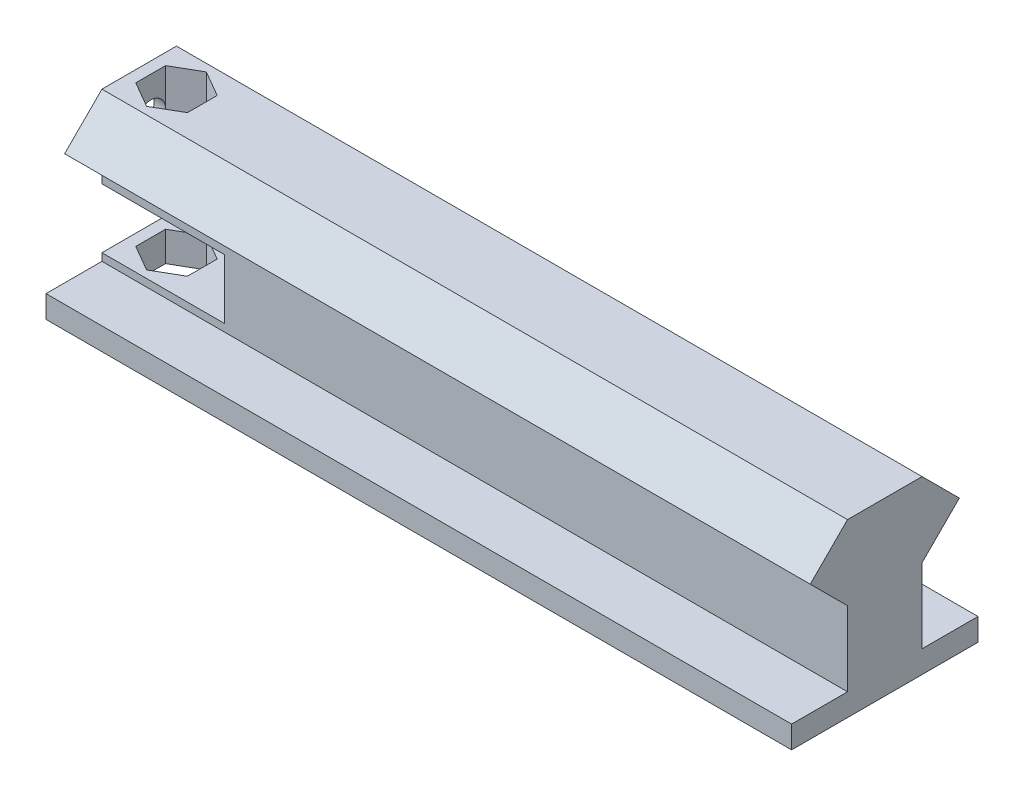
ISO-10303-21;
HEADER;
FILE_DESCRIPTION(('STEP AP214'),'2;1');
FILE_NAME('part.step','',(''),(''),'','','');
FILE_SCHEMA(('AUTOMOTIVE_DESIGN { 1 0 10303 214 1 1 1 1 }'));
ENDSEC;
DATA;
#1=APPLICATION_CONTEXT('core data for automotive mechanical design processes');
#2=APPLICATION_PROTOCOL_DEFINITION('international standard','automotive_design',2000,#1);
#3=PRODUCT_CONTEXT('',#1,'mechanical');
#4=PRODUCT('Part','Part','',(#3));
#5=PRODUCT_RELATED_PRODUCT_CATEGORY('part','',(#4));
#6=PRODUCT_DEFINITION_FORMATION('','',#4);
#7=PRODUCT_DEFINITION_CONTEXT('part definition',#1,'design');
#8=PRODUCT_DEFINITION('design','',#6,#7);
#9=PRODUCT_DEFINITION_SHAPE('','',#8);
#10=(LENGTH_UNIT() NAMED_UNIT(*) SI_UNIT(.MILLI.,.METRE.));
#11=(NAMED_UNIT(*) PLANE_ANGLE_UNIT() SI_UNIT($,.RADIAN.));
#12=(NAMED_UNIT(*) SI_UNIT($,.STERADIAN.) SOLID_ANGLE_UNIT());
#13=UNCERTAINTY_MEASURE_WITH_UNIT(LENGTH_MEASURE(1.E-05),#10,'distance_accuracy_value','');
#14=(GEOMETRIC_REPRESENTATION_CONTEXT(3) GLOBAL_UNCERTAINTY_ASSIGNED_CONTEXT((#13)) GLOBAL_UNIT_ASSIGNED_CONTEXT((#10,
#11,#12)) REPRESENTATION_CONTEXT('',''));
#15=CARTESIAN_POINT('',(0.,0.,0.));
#16=DIRECTION('',(0.,0.,1.));
#17=DIRECTION('',(1.,0.,0.));
#18=AXIS2_PLACEMENT_3D('',#15,#16,#17);
#19=CARTESIAN_POINT('',(-48.4641016151377,-8.,-2.));
#20=DIRECTION('',(-1.,0.,0.));
#21=DIRECTION('',(0.,0.,1.));
#22=AXIS2_PLACEMENT_3D('',#19,#20,#21);
#23=PLANE('',#22);
#24=DIRECTION('',(0.,1.,0.));
#25=VECTOR('',#24,1.);
#26=CARTESIAN_POINT('',(-48.4641016151377,-8.,2.));
#27=LINE('',#26,#25);
#28=CARTESIAN_POINT('',(-48.4641016151377,10.,2.));
#29=VERTEX_POINT('',#28);
#30=CARTESIAN_POINT('',(-48.4641016151377,15.,2.));
#31=VERTEX_POINT('',#30);
#32=EDGE_CURVE('E243',#29,#31,#27,.T.);
#33=ORIENTED_EDGE('',*,*,#32,.F.);
#34=CARTESIAN_POINT('',(-48.4641016151377,10.,0.));
#35=DIRECTION('',(-1.,0.,0.));
#36=DIRECTION('',(0.,0.,1.));
#37=AXIS2_PLACEMENT_3D('',#34,#35,#36);
#38=CIRCLE('',#37,2.);
#39=CARTESIAN_POINT('',(-48.4641016151377,10.,-2.));
#40=VERTEX_POINT('',#39);
#41=EDGE_CURVE('E54',#29,#40,#38,.T.);
#42=ORIENTED_EDGE('',*,*,#41,.T.);
#43=DIRECTION('',(0.,1.,0.));
#44=VECTOR('',#43,1.);
#45=CARTESIAN_POINT('',(-48.4641016151377,-8.,-2.));
#46=LINE('',#45,#44);
#47=CARTESIAN_POINT('',(-48.4641016151377,15.,-2.));
#48=VERTEX_POINT('',#47);
#49=EDGE_CURVE('E241',#40,#48,#46,.T.);
#50=ORIENTED_EDGE('',*,*,#49,.T.);
#51=DIRECTION('',(0.,0.,1.));
#52=VECTOR('',#51,1.);
#53=CARTESIAN_POINT('',(-48.4641016151377,15.,-2.));
#54=LINE('',#53,#52);
#55=EDGE_CURVE('E519',#48,#31,#54,.T.);
#56=ORIENTED_EDGE('',*,*,#55,.T.);
#57=EDGE_LOOP('',(#33,#42,#50,#56));
#58=FACE_BOUND('',#57,.T.);
#59=ADVANCED_FACE('F39',(#58),#23,.F.);
#60=CARTESIAN_POINT('',(50.,5.,-5.));
#61=DIRECTION('',(0.,0.,1.));
#62=DIRECTION('',(1.,0.,0.));
#63=AXIS2_PLACEMENT_3D('',#60,#61,#62);
#64=PLANE('',#63);
#65=DIRECTION('',(-1.,0.,0.));
#66=VECTOR('',#65,1.);
#67=CARTESIAN_POINT('',(50.,-4.,-5.));
#68=LINE('',#67,#66);
#69=CARTESIAN_POINT('',(-33.5435607626104,-4.,-5.));
#70=VERTEX_POINT('',#69);
#71=CARTESIAN_POINT('',(-50.,-4.,-5.));
#72=VERTEX_POINT('',#71);
#73=EDGE_CURVE('E323',#70,#72,#68,.T.);
#74=ORIENTED_EDGE('',*,*,#73,.F.);
#75=DIRECTION('',(0.,1.,0.));
#76=VECTOR('',#75,1.);
#77=CARTESIAN_POINT('',(-33.5435607626104,-4.,-5.));
#78=LINE('',#77,#76);
#79=CARTESIAN_POINT('',(-33.5435607626104,4.,-5.));
#80=VERTEX_POINT('',#79);
#81=EDGE_CURVE('E326',#70,#80,#78,.T.);
#82=ORIENTED_EDGE('',*,*,#81,.T.);
#83=DIRECTION('',(-1.,0.,0.));
#84=VECTOR('',#83,1.);
#85=CARTESIAN_POINT('',(50.,4.,-5.));
#86=LINE('',#85,#84);
#87=CARTESIAN_POINT('',(-50.,4.,-5.));
#88=VERTEX_POINT('',#87);
#89=EDGE_CURVE('E316',#80,#88,#86,.T.);
#90=ORIENTED_EDGE('',*,*,#89,.T.);
#91=DIRECTION('',(0.,1.,0.));
#92=VECTOR('',#91,1.);
#93=CARTESIAN_POINT('',(-50.,5.,-5.));
#94=LINE('',#93,#92);
#95=CARTESIAN_POINT('',(-50.,5.,-5.));
#96=VERTEX_POINT('',#95);
#97=EDGE_CURVE('E373',#88,#96,#94,.T.);
#98=ORIENTED_EDGE('',*,*,#97,.T.);
#99=DIRECTION('',(-1.,0.,0.));
#100=VECTOR('',#99,1.);
#101=CARTESIAN_POINT('',(50.,5.,-5.));
#102=LINE('',#101,#100);
#103=CARTESIAN_POINT('',(50.,5.,-5.));
#104=VERTEX_POINT('',#103);
#105=EDGE_CURVE('E448',#104,#96,#102,.T.);
#106=ORIENTED_EDGE('',*,*,#105,.F.);
#107=DIRECTION('',(0.,1.,0.));
#108=VECTOR('',#107,1.);
#109=CARTESIAN_POINT('',(50.,5.,-5.));
#110=LINE('',#109,#108);
#111=CARTESIAN_POINT('',(50.,-5.,-5.));
#112=VERTEX_POINT('',#111);
#113=EDGE_CURVE('E335',#112,#104,#110,.T.);
#114=ORIENTED_EDGE('',*,*,#113,.F.);
#115=DIRECTION('',(-1.,0.,0.));
#116=VECTOR('',#115,1.);
#117=CARTESIAN_POINT('',(50.,-5.,-5.));
#118=LINE('',#117,#116);
#119=CARTESIAN_POINT('',(-50.,-5.,-5.));
#120=VERTEX_POINT('',#119);
#121=EDGE_CURVE('E452',#112,#120,#118,.T.);
#122=ORIENTED_EDGE('',*,*,#121,.T.);
#123=EDGE_CURVE('E374',#120,#72,#94,.T.);
#124=ORIENTED_EDGE('',*,*,#123,.T.);
#125=EDGE_LOOP('',(#74,#82,#90,#98,#106,#114,#122,#124));
#126=FACE_BOUND('',#125,.T.);
#127=ADVANCED_FACE('F585',(#126),#64,.F.);
#128=CARTESIAN_POINT('',(50.,5.,5.));
#129=DIRECTION('',(0.,0.,-1.));
#130=DIRECTION('',(0.,1.,0.));
#131=AXIS2_PLACEMENT_3D('',#128,#129,#130);
#132=PLANE('',#131);
#133=DIRECTION('',(1.,0.,0.));
#134=VECTOR('',#133,1.);
#135=CARTESIAN_POINT('',(50.,-4.,5.));
#136=LINE('',#135,#134);
#137=CARTESIAN_POINT('',(-50.,-4.,5.));
#138=VERTEX_POINT('',#137);
#139=CARTESIAN_POINT('',(-33.5435607626104,-4.,5.));
#140=VERTEX_POINT('',#139);
#141=EDGE_CURVE('E320',#138,#140,#136,.T.);
#142=ORIENTED_EDGE('',*,*,#141,.F.);
#143=DIRECTION('',(0.,-1.,0.));
#144=VECTOR('',#143,1.);
#145=CARTESIAN_POINT('',(-50.,5.,5.));
#146=LINE('',#145,#144);
#147=CARTESIAN_POINT('',(-50.,-5.,5.));
#148=VERTEX_POINT('',#147);
#149=EDGE_CURVE('E393',#138,#148,#146,.T.);
#150=ORIENTED_EDGE('',*,*,#149,.T.);
#151=DIRECTION('',(-1.,0.,0.));
#152=VECTOR('',#151,1.);
#153=CARTESIAN_POINT('',(50.,-5.,5.));
#154=LINE('',#153,#152);
#155=CARTESIAN_POINT('',(50.,-5.,5.));
#156=VERTEX_POINT('',#155);
#157=EDGE_CURVE('E424',#156,#148,#154,.T.);
#158=ORIENTED_EDGE('',*,*,#157,.F.);
#159=DIRECTION('',(0.,-1.,0.));
#160=VECTOR('',#159,1.);
#161=CARTESIAN_POINT('',(50.,5.,5.));
#162=LINE('',#161,#160);
#163=CARTESIAN_POINT('',(50.,5.,5.));
#164=VERTEX_POINT('',#163);
#165=EDGE_CURVE('E354',#164,#156,#162,.T.);
#166=ORIENTED_EDGE('',*,*,#165,.F.);
#167=DIRECTION('',(-1.,0.,0.));
#168=VECTOR('',#167,1.);
#169=CARTESIAN_POINT('',(50.,5.,5.));
#170=LINE('',#169,#168);
#171=CARTESIAN_POINT('',(-50.,5.,5.));
#172=VERTEX_POINT('',#171);
#173=EDGE_CURVE('E428',#164,#172,#170,.T.);
#174=ORIENTED_EDGE('',*,*,#173,.T.);
#175=CARTESIAN_POINT('',(-50.,4.,5.));
#176=VERTEX_POINT('',#175);
#177=EDGE_CURVE('E394',#172,#176,#146,.T.);
#178=ORIENTED_EDGE('',*,*,#177,.T.);
#179=DIRECTION('',(1.,0.,0.));
#180=VECTOR('',#179,1.);
#181=CARTESIAN_POINT('',(50.,4.,5.));
#182=LINE('',#181,#180);
#183=CARTESIAN_POINT('',(-33.5435607626104,4.,5.));
#184=VERTEX_POINT('',#183);
#185=EDGE_CURVE('E309',#176,#184,#182,.T.);
#186=ORIENTED_EDGE('',*,*,#185,.T.);
#187=DIRECTION('',(0.,1.,0.));
#188=VECTOR('',#187,1.);
#189=CARTESIAN_POINT('',(-33.5435607626104,-4.,5.));
#190=LINE('',#189,#188);
#191=EDGE_CURVE('E463',#184,#140,#190,.F.);
#192=ORIENTED_EDGE('',*,*,#191,.T.);
#193=EDGE_LOOP('',(#142,#150,#158,#166,#174,#178,#186,#192));
#194=FACE_BOUND('',#193,.T.);
#195=ADVANCED_FACE('F556',(#194),#132,.F.);
#196=CARTESIAN_POINT('',(-50.,0.,0.));
#197=DIRECTION('',(-1.,0.,0.));
#198=DIRECTION('',(0.,0.,1.));
#199=AXIS2_PLACEMENT_3D('',#196,#197,#198);
#200=PLANE('',#199);
#201=ORIENTED_EDGE('',*,*,#149,.F.);
#202=DIRECTION('',(0.,0.,-1.));
#203=VECTOR('',#202,1.);
#204=CARTESIAN_POINT('',(-50.,-4.,0.));
#205=LINE('',#204,#203);
#206=EDGE_CURVE('E459',#138,#72,#205,.T.);
#207=ORIENTED_EDGE('',*,*,#206,.T.);
#208=ORIENTED_EDGE('',*,*,#123,.F.);
#209=DIRECTION('',(0.,0.,1.));
#210=VECTOR('',#209,1.);
#211=CARTESIAN_POINT('',(-50.,-5.,-5.));
#212=LINE('',#211,#210);
#213=CARTESIAN_POINT('',(-50.,-5.,-12.5));
#214=VERTEX_POINT('',#213);
#215=EDGE_CURVE('E330',#214,#120,#212,.T.);
#216=ORIENTED_EDGE('',*,*,#215,.F.);
#217=DIRECTION('',(0.,1.,0.));
#218=VECTOR('',#217,1.);
#219=CARTESIAN_POINT('',(-50.,-5.,-12.5));
#220=LINE('',#219,#218);
#221=CARTESIAN_POINT('',(-50.,-8.,-12.5));
#222=VERTEX_POINT('',#221);
#223=EDGE_CURVE('E336',#222,#214,#220,.T.);
#224=ORIENTED_EDGE('',*,*,#223,.F.);
#225=DIRECTION('',(0.,0.,-1.));
#226=VECTOR('',#225,1.);
#227=CARTESIAN_POINT('',(-50.,-8.,12.5));
#228=LINE('',#227,#226);
#229=CARTESIAN_POINT('',(-50.,-8.,12.5));
#230=VERTEX_POINT('',#229);
#231=EDGE_CURVE('E404',#230,#222,#228,.T.);
#232=ORIENTED_EDGE('',*,*,#231,.F.);
#233=DIRECTION('',(0.,-1.,0.));
#234=VECTOR('',#233,1.);
#235=CARTESIAN_POINT('',(-50.,-5.,12.5));
#236=LINE('',#235,#234);
#237=CARTESIAN_POINT('',(-50.,-5.,12.5));
#238=VERTEX_POINT('',#237);
#239=EDGE_CURVE('E401',#238,#230,#236,.T.);
#240=ORIENTED_EDGE('',*,*,#239,.F.);
#241=DIRECTION('',(0.,0.,1.));
#242=VECTOR('',#241,1.);
#243=CARTESIAN_POINT('',(-50.,-5.,5.));
#244=LINE('',#243,#242);
#245=EDGE_CURVE('E398',#148,#238,#244,.T.);
#246=ORIENTED_EDGE('',*,*,#245,.F.);
#247=EDGE_LOOP('',(#201,#207,#208,#216,#224,#232,#240,#246));
#248=FACE_BOUND('',#247,.T.);
#249=ADVANCED_FACE('F548',(#248),#200,.T.);
#250=CARTESIAN_POINT('',(50.,-5.,-5.));
#251=DIRECTION('',(0.,-1.,0.));
#252=DIRECTION('',(0.,0.,-1.));
#253=AXIS2_PLACEMENT_3D('',#250,#251,#252);
#254=PLANE('',#253);
#255=ORIENTED_EDGE('',*,*,#215,.T.);
#256=ORIENTED_EDGE('',*,*,#121,.F.);
#257=DIRECTION('',(0.,0.,1.));
#258=VECTOR('',#257,1.);
#259=CARTESIAN_POINT('',(50.,-5.,-5.));
#260=LINE('',#259,#258);
#261=CARTESIAN_POINT('',(50.,-5.,-12.5));
#262=VERTEX_POINT('',#261);
#263=EDGE_CURVE('E331',#262,#112,#260,.T.);
#264=ORIENTED_EDGE('',*,*,#263,.F.);
#265=DIRECTION('',(-1.,0.,0.));
#266=VECTOR('',#265,1.);
#267=CARTESIAN_POINT('',(50.,-5.,-12.5));
#268=LINE('',#267,#266);
#269=EDGE_CURVE('E369',#262,#214,#268,.T.);
#270=ORIENTED_EDGE('',*,*,#269,.T.);
#271=EDGE_LOOP('',(#255,#256,#264,#270));
#272=FACE_BOUND('',#271,.T.);
#273=ADVANCED_FACE('F41',(#272),#254,.F.);
#274=CARTESIAN_POINT('',(50.,5.,-5.));
#275=DIRECTION('',(0.,0.707106781186548,0.707106781186548));
#276=DIRECTION('',(0.,-0.707106781186548,0.707106781186548));
#277=AXIS2_PLACEMENT_3D('',#274,#275,#276);
#278=PLANE('',#277);
#279=DIRECTION('',(0.,0.707106781186548,-0.707106781186548));
#280=VECTOR('',#279,1.);
#281=CARTESIAN_POINT('',(-50.,5.,-5.));
#282=LINE('',#281,#280);
#283=CARTESIAN_POINT('',(-50.,10.,-10.));
#284=VERTEX_POINT('',#283);
#285=EDGE_CURVE('E378',#96,#284,#282,.T.);
#286=ORIENTED_EDGE('',*,*,#285,.T.);
#287=DIRECTION('',(-1.,0.,0.));
#288=VECTOR('',#287,1.);
#289=CARTESIAN_POINT('',(50.,10.,-10.));
#290=LINE('',#289,#288);
#291=CARTESIAN_POINT('',(50.,10.,-10.));
#292=VERTEX_POINT('',#291);
#293=EDGE_CURVE('E444',#292,#284,#290,.T.);
#294=ORIENTED_EDGE('',*,*,#293,.F.);
#295=DIRECTION('',(0.,0.707106781186548,-0.707106781186548));
#296=VECTOR('',#295,1.);
#297=CARTESIAN_POINT('',(50.,5.,-5.));
#298=LINE('',#297,#296);
#299=EDGE_CURVE('E339',#104,#292,#298,.T.);
#300=ORIENTED_EDGE('',*,*,#299,.F.);
#301=ORIENTED_EDGE('',*,*,#105,.T.);
#302=EDGE_LOOP('',(#286,#294,#300,#301));
#303=FACE_BOUND('',#302,.T.);
#304=ADVANCED_FACE('F580',(#303),#278,.F.);
#305=CARTESIAN_POINT('',(50.,10.,-10.));
#306=DIRECTION('',(0.,-0.707106781186548,0.707106781186547));
#307=DIRECTION('',(0.,-0.707106781186547,-0.707106781186548));
#308=AXIS2_PLACEMENT_3D('',#305,#306,#307);
#309=PLANE('',#308);
#310=DIRECTION('',(0.,0.707106781186547,0.707106781186548));
#311=VECTOR('',#310,1.);
#312=CARTESIAN_POINT('',(-50.,10.,-10.));
#313=LINE('',#312,#311);
#314=CARTESIAN_POINT('',(-50.,15.,-5.));
#315=VERTEX_POINT('',#314);
#316=EDGE_CURVE('E381',#284,#315,#313,.T.);
#317=ORIENTED_EDGE('',*,*,#316,.T.);
#318=DIRECTION('',(-1.,0.,0.));
#319=VECTOR('',#318,1.);
#320=CARTESIAN_POINT('',(50.,15.,-5.));
#321=LINE('',#320,#319);
#322=CARTESIAN_POINT('',(50.,15.,-5.));
#323=VERTEX_POINT('',#322);
#324=EDGE_CURVE('E440',#323,#315,#321,.T.);
#325=ORIENTED_EDGE('',*,*,#324,.F.);
#326=DIRECTION('',(0.,0.707106781186547,0.707106781186548));
#327=VECTOR('',#326,1.);
#328=CARTESIAN_POINT('',(50.,10.,-10.));
#329=LINE('',#328,#327);
#330=EDGE_CURVE('E342',#292,#323,#329,.T.);
#331=ORIENTED_EDGE('',*,*,#330,.F.);
#332=ORIENTED_EDGE('',*,*,#293,.T.);
#333=EDGE_LOOP('',(#317,#325,#331,#332));
#334=FACE_BOUND('',#333,.T.);
#335=ADVANCED_FACE('F577',(#334),#309,.F.);
#336=CARTESIAN_POINT('',(50.,15.,-5.));
#337=DIRECTION('',(0.,-1.,0.));
#338=DIRECTION('',(0.,0.,-1.));
#339=AXIS2_PLACEMENT_3D('',#336,#337,#338);
#340=PLANE('',#339);
#341=DIRECTION('',(0.866025403784438,0.,-0.500000000000001));
#342=VECTOR('',#341,1.);
#343=CARTESIAN_POINT('',(-45.,15.,4.));
#344=LINE('',#343,#342);
#345=CARTESIAN_POINT('',(-45.,15.,4.));
#346=VERTEX_POINT('',#345);
#347=CARTESIAN_POINT('',(-41.5358983848622,15.,1.99999999999999));
#348=VERTEX_POINT('',#347);
#349=EDGE_CURVE('E530',#346,#348,#344,.T.);
#350=ORIENTED_EDGE('',*,*,#349,.F.);
#351=DIRECTION('',(0.866025403784438,0.,0.5));
#352=VECTOR('',#351,1.);
#353=CARTESIAN_POINT('',(-48.4641016151377,15.,2.));
#354=LINE('',#353,#352);
#355=EDGE_CURVE('E62',#31,#346,#354,.T.);
#356=ORIENTED_EDGE('',*,*,#355,.F.);
#357=ORIENTED_EDGE('',*,*,#55,.F.);
#358=DIRECTION('',(-0.866025403784439,0.,0.5));
#359=VECTOR('',#358,1.);
#360=CARTESIAN_POINT('',(-45.,15.,-4.));
#361=LINE('',#360,#359);
#362=CARTESIAN_POINT('',(-45.,15.,-4.));
#363=VERTEX_POINT('',#362);
#364=EDGE_CURVE('E252',#363,#48,#361,.T.);
#365=ORIENTED_EDGE('',*,*,#364,.F.);
#366=DIRECTION('',(-0.866025403784438,0.,-0.5));
#367=VECTOR('',#366,1.);
#368=CARTESIAN_POINT('',(-41.5358983848622,15.,-2.));
#369=LINE('',#368,#367);
#370=CARTESIAN_POINT('',(-41.5358983848622,15.,-2.));
#371=VERTEX_POINT('',#370);
#372=EDGE_CURVE('E491',#371,#363,#369,.T.);
#373=ORIENTED_EDGE('',*,*,#372,.F.);
#374=DIRECTION('',(0.,0.,-1.));
#375=VECTOR('',#374,1.);
#376=CARTESIAN_POINT('',(-41.5358983848622,15.,1.99999999999999));
#377=LINE('',#376,#375);
#378=EDGE_CURVE('E526',#348,#371,#377,.T.);
#379=ORIENTED_EDGE('',*,*,#378,.F.);
#380=EDGE_LOOP('',(#350,#356,#357,#365,#373,#379));
#381=FACE_BOUND('',#380,.T.);
#382=DIRECTION('',(0.,0.,1.));
#383=VECTOR('',#382,1.);
#384=CARTESIAN_POINT('',(-50.,15.,-5.));
#385=LINE('',#384,#383);
#386=CARTESIAN_POINT('',(-50.,15.,5.));
#387=VERTEX_POINT('',#386);
#388=EDGE_CURVE('E384',#315,#387,#385,.T.);
#389=ORIENTED_EDGE('',*,*,#388,.T.);
#390=DIRECTION('',(-1.,0.,0.));
#391=VECTOR('',#390,1.);
#392=CARTESIAN_POINT('',(50.,15.,5.));
#393=LINE('',#392,#391);
#394=CARTESIAN_POINT('',(50.,15.,5.));
#395=VERTEX_POINT('',#394);
#396=EDGE_CURVE('E436',#395,#387,#393,.T.);
#397=ORIENTED_EDGE('',*,*,#396,.F.);
#398=DIRECTION('',(0.,0.,1.));
#399=VECTOR('',#398,1.);
#400=CARTESIAN_POINT('',(50.,15.,-5.));
#401=LINE('',#400,#399);
#402=EDGE_CURVE('E345',#323,#395,#401,.T.);
#403=ORIENTED_EDGE('',*,*,#402,.F.);
#404=ORIENTED_EDGE('',*,*,#324,.T.);
#405=EDGE_LOOP('',(#389,#397,#403,#404));
#406=FACE_BOUND('',#405,.T.);
#407=ADVANCED_FACE('F573',(#381,#406),#340,.F.);
#408=CARTESIAN_POINT('',(50.,15.,5.));
#409=DIRECTION('',(0.,-0.707106781186547,-0.707106781186548));
#410=DIRECTION('',(0.,0.707106781186548,-0.707106781186547));
#411=AXIS2_PLACEMENT_3D('',#408,#409,#410);
#412=PLANE('',#411);
#413=DIRECTION('',(0.,-0.707106781186548,0.707106781186547));
#414=VECTOR('',#413,1.);
#415=CARTESIAN_POINT('',(-50.,15.,5.));
#416=LINE('',#415,#414);
#417=CARTESIAN_POINT('',(-50.,9.99999999999999,10.));
#418=VERTEX_POINT('',#417);
#419=EDGE_CURVE('E387',#387,#418,#416,.T.);
#420=ORIENTED_EDGE('',*,*,#419,.T.);
#421=DIRECTION('',(-1.,0.,0.));
#422=VECTOR('',#421,1.);
#423=CARTESIAN_POINT('',(50.,9.99999999999999,10.));
#424=LINE('',#423,#422);
#425=CARTESIAN_POINT('',(50.,9.99999999999999,10.));
#426=VERTEX_POINT('',#425);
#427=EDGE_CURVE('E432',#426,#418,#424,.T.);
#428=ORIENTED_EDGE('',*,*,#427,.F.);
#429=DIRECTION('',(0.,-0.707106781186548,0.707106781186547));
#430=VECTOR('',#429,1.);
#431=CARTESIAN_POINT('',(50.,15.,5.));
#432=LINE('',#431,#430);
#433=EDGE_CURVE('E348',#395,#426,#432,.T.);
#434=ORIENTED_EDGE('',*,*,#433,.F.);
#435=ORIENTED_EDGE('',*,*,#396,.T.);
#436=EDGE_LOOP('',(#420,#428,#434,#435));
#437=FACE_BOUND('',#436,.T.);
#438=ADVANCED_FACE('F568',(#437),#412,.F.);
#439=CARTESIAN_POINT('',(50.,9.99999999999999,10.));
#440=DIRECTION('',(0.,0.707106781186548,-0.707106781186547));
#441=DIRECTION('',(0.,0.707106781186547,0.707106781186548));
#442=AXIS2_PLACEMENT_3D('',#439,#440,#441);
#443=PLANE('',#442);
#444=DIRECTION('',(0.,-0.707106781186547,-0.707106781186548));
#445=VECTOR('',#444,1.);
#446=CARTESIAN_POINT('',(-50.,9.99999999999999,10.));
#447=LINE('',#446,#445);
#448=EDGE_CURVE('E390',#418,#172,#447,.T.);
#449=ORIENTED_EDGE('',*,*,#448,.T.);
#450=ORIENTED_EDGE('',*,*,#173,.F.);
#451=DIRECTION('',(0.,-0.707106781186547,-0.707106781186548));
#452=VECTOR('',#451,1.);
#453=CARTESIAN_POINT('',(50.,9.99999999999999,10.));
#454=LINE('',#453,#452);
#455=EDGE_CURVE('E351',#426,#164,#454,.T.);
#456=ORIENTED_EDGE('',*,*,#455,.F.);
#457=ORIENTED_EDGE('',*,*,#427,.T.);
#458=EDGE_LOOP('',(#449,#450,#456,#457));
#459=FACE_BOUND('',#458,.T.);
#460=ADVANCED_FACE('F562',(#459),#443,.F.);
#461=CARTESIAN_POINT('',(50.,-5.,5.));
#462=DIRECTION('',(0.,-1.,0.));
#463=DIRECTION('',(0.,0.,-1.));
#464=AXIS2_PLACEMENT_3D('',#461,#462,#463);
#465=PLANE('',#464);
#466=ORIENTED_EDGE('',*,*,#245,.T.);
#467=DIRECTION('',(-1.,0.,0.));
#468=VECTOR('',#467,1.);
#469=CARTESIAN_POINT('',(50.,-5.,12.5));
#470=LINE('',#469,#468);
#471=CARTESIAN_POINT('',(50.,-5.,12.5));
#472=VERTEX_POINT('',#471);
#473=EDGE_CURVE('E420',#472,#238,#470,.T.);
#474=ORIENTED_EDGE('',*,*,#473,.F.);
#475=DIRECTION('',(0.,0.,1.));
#476=VECTOR('',#475,1.);
#477=CARTESIAN_POINT('',(50.,-5.,5.));
#478=LINE('',#477,#476);
#479=EDGE_CURVE('E357',#156,#472,#478,.T.);
#480=ORIENTED_EDGE('',*,*,#479,.F.);
#481=ORIENTED_EDGE('',*,*,#157,.T.);
#482=EDGE_LOOP('',(#466,#474,#480,#481));
#483=FACE_BOUND('',#482,.T.);
#484=ADVANCED_FACE('F836',(#483),#465,.F.);
#485=CARTESIAN_POINT('',(50.,-5.,12.5));
#486=DIRECTION('',(0.,0.,-1.));
#487=DIRECTION('',(-1.,0.,0.));
#488=AXIS2_PLACEMENT_3D('',#485,#486,#487);
#489=PLANE('',#488);
#490=ORIENTED_EDGE('',*,*,#239,.T.);
#491=DIRECTION('',(-1.,0.,0.));
#492=VECTOR('',#491,1.);
#493=CARTESIAN_POINT('',(50.,-8.,12.5));
#494=LINE('',#493,#492);
#495=CARTESIAN_POINT('',(50.,-8.,12.5));
#496=VERTEX_POINT('',#495);
#497=EDGE_CURVE('E416',#496,#230,#494,.T.);
#498=ORIENTED_EDGE('',*,*,#497,.F.);
#499=DIRECTION('',(0.,-1.,0.));
#500=VECTOR('',#499,1.);
#501=CARTESIAN_POINT('',(50.,-5.,12.5));
#502=LINE('',#501,#500);
#503=EDGE_CURVE('E360',#472,#496,#502,.T.);
#504=ORIENTED_EDGE('',*,*,#503,.F.);
#505=ORIENTED_EDGE('',*,*,#473,.T.);
#506=EDGE_LOOP('',(#490,#498,#504,#505));
#507=FACE_BOUND('',#506,.T.);
#508=ADVANCED_FACE('F770',(#507),#489,.F.);
#509=CARTESIAN_POINT('',(50.,-8.,12.5));
#510=DIRECTION('',(0.,1.,0.));
#511=DIRECTION('',(0.,0.,1.));
#512=AXIS2_PLACEMENT_3D('',#509,#510,#511);
#513=PLANE('',#512);
#514=DIRECTION('',(0.,0.,1.));
#515=VECTOR('',#514,1.);
#516=CARTESIAN_POINT('',(-48.4641016151377,-8.,-2.));
#517=LINE('',#516,#515);
#518=CARTESIAN_POINT('',(-48.4641016151377,-8.,-2.));
#519=VERTEX_POINT('',#518);
#520=CARTESIAN_POINT('',(-48.4641016151377,-8.,2.));
#521=VERTEX_POINT('',#520);
#522=EDGE_CURVE('E497',#519,#521,#517,.T.);
#523=ORIENTED_EDGE('',*,*,#522,.T.);
#524=DIRECTION('',(0.866025403784438,0.,0.5));
#525=VECTOR('',#524,1.);
#526=CARTESIAN_POINT('',(-48.4641016151377,-8.,2.));
#527=LINE('',#526,#525);
#528=CARTESIAN_POINT('',(-45.,-8.,4.));
#529=VERTEX_POINT('',#528);
#530=EDGE_CURVE('E515',#521,#529,#527,.T.);
#531=ORIENTED_EDGE('',*,*,#530,.T.);
#532=DIRECTION('',(0.866025403784438,0.,-0.500000000000001));
#533=VECTOR('',#532,1.);
#534=CARTESIAN_POINT('',(-45.,-8.,4.));
#535=LINE('',#534,#533);
#536=CARTESIAN_POINT('',(-41.5358983848622,-8.,1.99999999999997));
#537=VERTEX_POINT('',#536);
#538=EDGE_CURVE('E511',#529,#537,#535,.T.);
#539=ORIENTED_EDGE('',*,*,#538,.T.);
#540=DIRECTION('',(0.,0.,-1.));
#541=VECTOR('',#540,1.);
#542=CARTESIAN_POINT('',(-41.5358983848622,-8.,1.99999999999999));
#543=LINE('',#542,#541);
#544=CARTESIAN_POINT('',(-41.5358983848622,-8.,-2.));
#545=VERTEX_POINT('',#544);
#546=EDGE_CURVE('E507',#537,#545,#543,.T.);
#547=ORIENTED_EDGE('',*,*,#546,.T.);
#548=DIRECTION('',(-0.866025403784438,0.,-0.5));
#549=VECTOR('',#548,1.);
#550=CARTESIAN_POINT('',(-41.5358983848622,-8.,-2.));
#551=LINE('',#550,#549);
#552=CARTESIAN_POINT('',(-45.,-8.,-4.));
#553=VERTEX_POINT('',#552);
#554=EDGE_CURVE('E503',#545,#553,#551,.T.);
#555=ORIENTED_EDGE('',*,*,#554,.T.);
#556=DIRECTION('',(-0.866025403784439,0.,0.5));
#557=VECTOR('',#556,1.);
#558=CARTESIAN_POINT('',(-45.,-8.,-4.));
#559=LINE('',#558,#557);
#560=EDGE_CURVE('E500',#553,#519,#559,.T.);
#561=ORIENTED_EDGE('',*,*,#560,.T.);
#562=EDGE_LOOP('',(#523,#531,#539,#547,#555,#561));
#563=FACE_BOUND('',#562,.T.);
#564=ORIENTED_EDGE('',*,*,#231,.T.);
#565=DIRECTION('',(-1.,0.,0.));
#566=VECTOR('',#565,1.);
#567=CARTESIAN_POINT('',(50.,-8.,-12.5));
#568=LINE('',#567,#566);
#569=CARTESIAN_POINT('',(50.,-8.,-12.5));
#570=VERTEX_POINT('',#569);
#571=EDGE_CURVE('E412',#570,#222,#568,.T.);
#572=ORIENTED_EDGE('',*,*,#571,.F.);
#573=DIRECTION('',(0.,0.,-1.));
#574=VECTOR('',#573,1.);
#575=CARTESIAN_POINT('',(50.,-8.,12.5));
#576=LINE('',#575,#574);
#577=EDGE_CURVE('E363',#496,#570,#576,.T.);
#578=ORIENTED_EDGE('',*,*,#577,.F.);
#579=ORIENTED_EDGE('',*,*,#497,.T.);
#580=EDGE_LOOP('',(#564,#572,#578,#579));
#581=FACE_BOUND('',#580,.T.);
#582=ADVANCED_FACE('F650',(#563,#581),#513,.F.);
#583=CARTESIAN_POINT('',(50.,-5.,-12.5));
#584=DIRECTION('',(0.,0.,1.));
#585=DIRECTION('',(1.,0.,0.));
#586=AXIS2_PLACEMENT_3D('',#583,#584,#585);
#587=PLANE('',#586);
#588=ORIENTED_EDGE('',*,*,#223,.T.);
#589=ORIENTED_EDGE('',*,*,#269,.F.);
#590=DIRECTION('',(0.,1.,0.));
#591=VECTOR('',#590,1.);
#592=CARTESIAN_POINT('',(50.,-5.,-12.5));
#593=LINE('',#592,#591);
#594=EDGE_CURVE('E366',#570,#262,#593,.T.);
#595=ORIENTED_EDGE('',*,*,#594,.F.);
#596=ORIENTED_EDGE('',*,*,#571,.T.);
#597=EDGE_LOOP('',(#588,#589,#595,#596));
#598=FACE_BOUND('',#597,.T.);
#599=ADVANCED_FACE('F769',(#598),#587,.F.);
#600=CARTESIAN_POINT('',(50.,0.,0.));
#601=DIRECTION('',(-1.,0.,0.));
#602=DIRECTION('',(0.,0.,1.));
#603=AXIS2_PLACEMENT_3D('',#600,#601,#602);
#604=PLANE('',#603);
#605=ORIENTED_EDGE('',*,*,#263,.T.);
#606=ORIENTED_EDGE('',*,*,#113,.T.);
#607=ORIENTED_EDGE('',*,*,#299,.T.);
#608=ORIENTED_EDGE('',*,*,#330,.T.);
#609=ORIENTED_EDGE('',*,*,#402,.T.);
#610=ORIENTED_EDGE('',*,*,#433,.T.);
#611=ORIENTED_EDGE('',*,*,#455,.T.);
#612=ORIENTED_EDGE('',*,*,#165,.T.);
#613=ORIENTED_EDGE('',*,*,#479,.T.);
#614=ORIENTED_EDGE('',*,*,#503,.T.);
#615=ORIENTED_EDGE('',*,*,#577,.T.);
#616=ORIENTED_EDGE('',*,*,#594,.T.);
#617=EDGE_LOOP('',(#605,#606,#607,#608,#609,#610,#611,#612,#613,#614,#615,#616));
#618=FACE_BOUND('',#617,.T.);
#619=ADVANCED_FACE('F546',(#618),#604,.F.);
#620=CARTESIAN_POINT('',(-50.,10.,0.));
#621=DIRECTION('',(-1.,0.,0.));
#622=DIRECTION('',(0.,0.,1.));
#623=AXIS2_PLACEMENT_3D('',#620,#621,#622);
#624=CIRCLE('',#623,2.);
#625=CARTESIAN_POINT('',(-50.,10.,2.));
#626=VERTEX_POINT('',#625);
#627=EDGE_CURVE('E236',#626,#626,#624,.T.);
#628=ORIENTED_EDGE('',*,*,#627,.F.);
#629=EDGE_LOOP('',(#628));
#630=FACE_BOUND('',#629,.T.);
#631=DIRECTION('',(0.,0.,-1.));
#632=VECTOR('',#631,1.);
#633=CARTESIAN_POINT('',(-50.,4.,0.));
#634=LINE('',#633,#632);
#635=EDGE_CURVE('E456',#176,#88,#634,.T.);
#636=ORIENTED_EDGE('',*,*,#635,.F.);
#637=ORIENTED_EDGE('',*,*,#177,.F.);
#638=ORIENTED_EDGE('',*,*,#448,.F.);
#639=ORIENTED_EDGE('',*,*,#419,.F.);
#640=ORIENTED_EDGE('',*,*,#388,.F.);
#641=ORIENTED_EDGE('',*,*,#316,.F.);
#642=ORIENTED_EDGE('',*,*,#285,.F.);
#643=ORIENTED_EDGE('',*,*,#97,.F.);
#644=EDGE_LOOP('',(#636,#637,#638,#639,#640,#641,#642,#643));
#645=FACE_BOUND('',#644,.T.);
#646=ADVANCED_FACE('F542',(#630,#645),#200,.T.);
#647=CARTESIAN_POINT('',(-45.,-4.,0.));
#648=DIRECTION('',(0.,1.,0.));
#649=DIRECTION('',(0.,0.,1.));
#650=AXIS2_PLACEMENT_3D('',#647,#648,#649);
#651=CYLINDRICAL_SURFACE('',#650,12.5);
#652=CARTESIAN_POINT('',(-45.,-4.,0.));
#653=DIRECTION('',(0.,1.,0.));
#654=DIRECTION('',(0.,0.,1.));
#655=AXIS2_PLACEMENT_3D('',#652,#653,#654);
#656=CIRCLE('',#655,12.5);
#657=EDGE_CURVE('E305',#140,#70,#656,.T.);
#658=ORIENTED_EDGE('',*,*,#657,.F.);
#659=ORIENTED_EDGE('',*,*,#191,.F.);
#660=CARTESIAN_POINT('',(-45.,4.,0.));
#661=DIRECTION('',(0.,1.,0.));
#662=DIRECTION('',(0.,0.,1.));
#663=AXIS2_PLACEMENT_3D('',#660,#661,#662);
#664=CIRCLE('',#663,12.5);
#665=EDGE_CURVE('E304',#184,#80,#664,.T.);
#666=ORIENTED_EDGE('',*,*,#665,.T.);
#667=ORIENTED_EDGE('',*,*,#81,.F.);
#668=EDGE_LOOP('',(#658,#659,#666,#667));
#669=FACE_BOUND('',#668,.T.);
#670=ADVANCED_FACE('F545',(#669),#651,.F.);
#671=CARTESIAN_POINT('',(0.,-4.,0.));
#672=DIRECTION('',(0.,1.,0.));
#673=DIRECTION('',(0.,0.,1.));
#674=AXIS2_PLACEMENT_3D('',#671,#672,#673);
#675=PLANE('',#674);
#676=DIRECTION('',(0.866025403784439,0.,0.5));
#677=VECTOR('',#676,1.);
#678=CARTESIAN_POINT('',(-12.9820508075689,-4.,22.4855715851499));
#679=LINE('',#678,#677);
#680=CARTESIAN_POINT('',(-48.4641016151377,-4.,2.));
#681=VERTEX_POINT('',#680);
#682=CARTESIAN_POINT('',(-45.,-4.,4.));
#683=VERTEX_POINT('',#682);
#684=EDGE_CURVE('E300',#681,#683,#679,.T.);
#685=ORIENTED_EDGE('',*,*,#684,.F.);
#686=DIRECTION('',(0.,0.,1.));
#687=VECTOR('',#686,1.);
#688=CARTESIAN_POINT('',(-48.4641016151377,-4.,0.));
#689=LINE('',#688,#687);
#690=CARTESIAN_POINT('',(-48.4641016151377,-4.,-2.));
#691=VERTEX_POINT('',#690);
#692=EDGE_CURVE('E297',#691,#681,#689,.T.);
#693=ORIENTED_EDGE('',*,*,#692,.F.);
#694=DIRECTION('',(-0.866025403784439,0.,0.5));
#695=VECTOR('',#694,1.);
#696=CARTESIAN_POINT('',(-12.9820508075689,-4.,-22.4855715851499));
#697=LINE('',#696,#695);
#698=CARTESIAN_POINT('',(-45.,-4.,-4.));
#699=VERTEX_POINT('',#698);
#700=EDGE_CURVE('E294',#699,#691,#697,.T.);
#701=ORIENTED_EDGE('',*,*,#700,.F.);
#702=DIRECTION('',(-0.866025403784438,0.,-0.5));
#703=VECTOR('',#702,1.);
#704=CARTESIAN_POINT('',(-9.51794919243114,-4.,16.4855715851499));
#705=LINE('',#704,#703);
#706=CARTESIAN_POINT('',(-41.5358983848622,-4.,-2.));
#707=VERTEX_POINT('',#706);
#708=EDGE_CURVE('E291',#707,#699,#705,.T.);
#709=ORIENTED_EDGE('',*,*,#708,.F.);
#710=DIRECTION('',(0.,0.,-1.));
#711=VECTOR('',#710,1.);
#712=CARTESIAN_POINT('',(-41.5358983848622,-4.,0.));
#713=LINE('',#712,#711);
#714=CARTESIAN_POINT('',(-41.5358983848622,-4.,1.99999999999999));
#715=VERTEX_POINT('',#714);
#716=EDGE_CURVE('E288',#715,#707,#713,.T.);
#717=ORIENTED_EDGE('',*,*,#716,.F.);
#718=DIRECTION('',(0.866025403784438,0.,-0.500000000000001));
#719=VECTOR('',#718,1.);
#720=CARTESIAN_POINT('',(-9.51794919243115,-4.,-16.4855715851499));
#721=LINE('',#720,#719);
#722=EDGE_CURVE('E285',#683,#715,#721,.T.);
#723=ORIENTED_EDGE('',*,*,#722,.F.);
#724=EDGE_LOOP('',(#685,#693,#701,#709,#717,#723));
#725=FACE_BOUND('',#724,.T.);
#726=ORIENTED_EDGE('',*,*,#73,.T.);
#727=ORIENTED_EDGE('',*,*,#206,.F.);
#728=ORIENTED_EDGE('',*,*,#141,.T.);
#729=ORIENTED_EDGE('',*,*,#657,.T.);
#730=EDGE_LOOP('',(#726,#727,#728,#729));
#731=FACE_BOUND('',#730,.T.);
#732=ADVANCED_FACE('F641',(#725,#731),#675,.T.);
#733=CARTESIAN_POINT('',(0.,4.,0.));
#734=DIRECTION('',(0.,1.,0.));
#735=DIRECTION('',(0.,0.,1.));
#736=AXIS2_PLACEMENT_3D('',#733,#734,#735);
#737=PLANE('',#736);
#738=DIRECTION('',(0.,0.,1.));
#739=VECTOR('',#738,1.);
#740=CARTESIAN_POINT('',(-48.4641016151377,4.,0.));
#741=LINE('',#740,#739);
#742=CARTESIAN_POINT('',(-48.4641016151377,4.,-2.));
#743=VERTEX_POINT('',#742);
#744=CARTESIAN_POINT('',(-48.4641016151377,4.,2.));
#745=VERTEX_POINT('',#744);
#746=EDGE_CURVE('E48',#743,#745,#741,.T.);
#747=ORIENTED_EDGE('',*,*,#746,.T.);
#748=DIRECTION('',(0.866025403784439,0.,0.5));
#749=VECTOR('',#748,1.);
#750=CARTESIAN_POINT('',(-12.9820508075689,4.,22.4855715851499));
#751=LINE('',#750,#749);
#752=CARTESIAN_POINT('',(-45.,4.,4.));
#753=VERTEX_POINT('',#752);
#754=EDGE_CURVE('E11',#745,#753,#751,.T.);
#755=ORIENTED_EDGE('',*,*,#754,.T.);
#756=DIRECTION('',(0.866025403784438,0.,-0.500000000000001));
#757=VECTOR('',#756,1.);
#758=CARTESIAN_POINT('',(-9.51794919243115,4.,-16.4855715851499));
#759=LINE('',#758,#757);
#760=CARTESIAN_POINT('',(-41.5358983848622,4.,1.99999999999999));
#761=VERTEX_POINT('',#760);
#762=EDGE_CURVE('E467',#753,#761,#759,.T.);
#763=ORIENTED_EDGE('',*,*,#762,.T.);
#764=DIRECTION('',(0.,0.,-1.));
#765=VECTOR('',#764,1.);
#766=CARTESIAN_POINT('',(-41.5358983848622,4.,0.));
#767=LINE('',#766,#765);
#768=CARTESIAN_POINT('',(-41.5358983848622,4.,-2.));
#769=VERTEX_POINT('',#768);
#770=EDGE_CURVE('E471',#761,#769,#767,.T.);
#771=ORIENTED_EDGE('',*,*,#770,.T.);
#772=DIRECTION('',(-0.866025403784438,0.,-0.5));
#773=VECTOR('',#772,1.);
#774=CARTESIAN_POINT('',(-9.51794919243114,4.,16.4855715851499));
#775=LINE('',#774,#773);
#776=CARTESIAN_POINT('',(-45.,4.,-4.));
#777=VERTEX_POINT('',#776);
#778=EDGE_CURVE('E475',#769,#777,#775,.T.);
#779=ORIENTED_EDGE('',*,*,#778,.T.);
#780=DIRECTION('',(-0.866025403784439,0.,0.5));
#781=VECTOR('',#780,1.);
#782=CARTESIAN_POINT('',(-12.9820508075689,4.,-22.4855715851499));
#783=LINE('',#782,#781);
#784=EDGE_CURVE('E479',#777,#743,#783,.T.);
#785=ORIENTED_EDGE('',*,*,#784,.T.);
#786=EDGE_LOOP('',(#747,#755,#763,#771,#779,#785));
#787=FACE_BOUND('',#786,.T.);
#788=ORIENTED_EDGE('',*,*,#665,.F.);
#789=ORIENTED_EDGE('',*,*,#185,.F.);
#790=ORIENTED_EDGE('',*,*,#635,.T.);
#791=ORIENTED_EDGE('',*,*,#89,.F.);
#792=EDGE_LOOP('',(#788,#789,#790,#791));
#793=FACE_BOUND('',#792,.T.);
#794=ADVANCED_FACE('F483',(#787,#793),#737,.F.);
#795=CARTESIAN_POINT('',(-45.,-8.,4.));
#796=DIRECTION('',(0.500000000000001,0.,0.866025403784438));
#797=DIRECTION('',(0.866025403784438,0.,-0.500000000000001));
#798=AXIS2_PLACEMENT_3D('',#795,#796,#797);
#799=PLANE('',#798);
#800=DIRECTION('',(0.,1.,0.));
#801=VECTOR('',#800,1.);
#802=CARTESIAN_POINT('',(-45.,-8.,4.));
#803=LINE('',#802,#801);
#804=EDGE_CURVE('E284',#753,#346,#803,.T.);
#805=ORIENTED_EDGE('',*,*,#804,.T.);
#806=ORIENTED_EDGE('',*,*,#349,.T.);
#807=DIRECTION('',(0.,1.,0.));
#808=VECTOR('',#807,1.);
#809=CARTESIAN_POINT('',(-41.5358983848622,-8.,1.99999999999999));
#810=LINE('',#809,#808);
#811=EDGE_CURVE('E280',#761,#348,#810,.T.);
#812=ORIENTED_EDGE('',*,*,#811,.F.);
#813=ORIENTED_EDGE('',*,*,#762,.F.);
#814=EDGE_LOOP('',(#805,#806,#812,#813));
#815=FACE_BOUND('',#814,.T.);
#816=ADVANCED_FACE('F597',(#815),#799,.F.);
#817=CARTESIAN_POINT('',(-41.5358983848622,-8.,1.99999999999999));
#818=DIRECTION('',(1.,0.,0.));
#819=DIRECTION('',(0.,0.,-1.));
#820=AXIS2_PLACEMENT_3D('',#817,#818,#819);
#821=PLANE('',#820);
#822=ORIENTED_EDGE('',*,*,#811,.T.);
#823=ORIENTED_EDGE('',*,*,#378,.T.);
#824=DIRECTION('',(0.,1.,0.));
#825=VECTOR('',#824,1.);
#826=CARTESIAN_POINT('',(-41.5358983848622,-8.,-2.));
#827=LINE('',#826,#825);
#828=EDGE_CURVE('E275',#769,#371,#827,.T.);
#829=ORIENTED_EDGE('',*,*,#828,.F.);
#830=ORIENTED_EDGE('',*,*,#770,.F.);
#831=EDGE_LOOP('',(#822,#823,#829,#830));
#832=FACE_BOUND('',#831,.T.);
#833=ADVANCED_FACE('F600',(#832),#821,.F.);
#834=CARTESIAN_POINT('',(-41.5358983848622,-8.,-2.));
#835=DIRECTION('',(0.5,0.,-0.866025403784439));
#836=DIRECTION('',(-0.866025403784438,0.,-0.5));
#837=AXIS2_PLACEMENT_3D('',#834,#835,#836);
#838=PLANE('',#837);
#839=ORIENTED_EDGE('',*,*,#828,.T.);
#840=ORIENTED_EDGE('',*,*,#372,.T.);
#841=DIRECTION('',(0.,1.,0.));
#842=VECTOR('',#841,1.);
#843=CARTESIAN_POINT('',(-45.,-8.,-4.));
#844=LINE('',#843,#842);
#845=EDGE_CURVE('E270',#777,#363,#844,.T.);
#846=ORIENTED_EDGE('',*,*,#845,.F.);
#847=ORIENTED_EDGE('',*,*,#778,.F.);
#848=EDGE_LOOP('',(#839,#840,#846,#847));
#849=FACE_BOUND('',#848,.T.);
#850=ADVANCED_FACE('F488',(#849),#838,.F.);
#851=CARTESIAN_POINT('',(-45.,-8.,-4.));
#852=DIRECTION('',(-0.5,0.,-0.866025403784439));
#853=DIRECTION('',(-0.866025403784439,0.,0.5));
#854=AXIS2_PLACEMENT_3D('',#851,#852,#853);
#855=PLANE('',#854);
#856=ORIENTED_EDGE('',*,*,#845,.T.);
#857=ORIENTED_EDGE('',*,*,#364,.T.);
#858=ORIENTED_EDGE('',*,*,#49,.F.);
#859=EDGE_CURVE('E249',#743,#40,#46,.T.);
#860=ORIENTED_EDGE('',*,*,#859,.F.);
#861=ORIENTED_EDGE('',*,*,#784,.F.);
#862=EDGE_LOOP('',(#856,#857,#858,#860,#861));
#863=FACE_BOUND('',#862,.T.);
#864=ADVANCED_FACE('F248',(#863),#855,.F.);
#865=ORIENTED_EDGE('',*,*,#859,.T.);
#866=EDGE_CURVE('E229',#40,#29,#38,.T.);
#867=ORIENTED_EDGE('',*,*,#866,.T.);
#868=EDGE_CURVE('E590',#745,#29,#27,.T.);
#869=ORIENTED_EDGE('',*,*,#868,.F.);
#870=ORIENTED_EDGE('',*,*,#746,.F.);
#871=EDGE_LOOP('',(#865,#867,#869,#870));
#872=FACE_BOUND('',#871,.T.);
#873=ADVANCED_FACE('F258',(#872),#23,.F.);
#874=CARTESIAN_POINT('',(-48.4641016151377,-8.,2.));
#875=DIRECTION('',(-0.5,0.,0.866025403784439));
#876=DIRECTION('',(0.866025403784439,0.,0.5));
#877=AXIS2_PLACEMENT_3D('',#874,#875,#876);
#878=PLANE('',#877);
#879=ORIENTED_EDGE('',*,*,#868,.T.);
#880=ORIENTED_EDGE('',*,*,#32,.T.);
#881=ORIENTED_EDGE('',*,*,#355,.T.);
#882=ORIENTED_EDGE('',*,*,#804,.F.);
#883=ORIENTED_EDGE('',*,*,#754,.F.);
#884=EDGE_LOOP('',(#879,#880,#881,#882,#883));
#885=FACE_BOUND('',#884,.T.);
#886=ADVANCED_FACE('F592',(#885),#878,.F.);
#887=ORIENTED_EDGE('',*,*,#684,.T.);
#888=EDGE_CURVE('E281',#529,#683,#803,.T.);
#889=ORIENTED_EDGE('',*,*,#888,.F.);
#890=ORIENTED_EDGE('',*,*,#530,.F.);
#891=EDGE_CURVE('E265',#521,#681,#27,.T.);
#892=ORIENTED_EDGE('',*,*,#891,.T.);
#893=EDGE_LOOP('',(#887,#889,#890,#892));
#894=FACE_BOUND('',#893,.T.);
#895=ADVANCED_FACE('F625',(#894),#878,.F.);
#896=ORIENTED_EDGE('',*,*,#692,.T.);
#897=ORIENTED_EDGE('',*,*,#891,.F.);
#898=ORIENTED_EDGE('',*,*,#522,.F.);
#899=EDGE_CURVE('E257',#519,#691,#46,.T.);
#900=ORIENTED_EDGE('',*,*,#899,.T.);
#901=EDGE_LOOP('',(#896,#897,#898,#900));
#902=FACE_BOUND('',#901,.T.);
#903=ADVANCED_FACE('F616',(#902),#23,.F.);
#904=ORIENTED_EDGE('',*,*,#700,.T.);
#905=ORIENTED_EDGE('',*,*,#899,.F.);
#906=ORIENTED_EDGE('',*,*,#560,.F.);
#907=EDGE_CURVE('E255',#553,#699,#844,.T.);
#908=ORIENTED_EDGE('',*,*,#907,.T.);
#909=EDGE_LOOP('',(#904,#905,#906,#908));
#910=FACE_BOUND('',#909,.T.);
#911=ADVANCED_FACE('F624',(#910),#855,.F.);
#912=ORIENTED_EDGE('',*,*,#708,.T.);
#913=ORIENTED_EDGE('',*,*,#907,.F.);
#914=ORIENTED_EDGE('',*,*,#554,.F.);
#915=EDGE_CURVE('E271',#545,#707,#827,.T.);
#916=ORIENTED_EDGE('',*,*,#915,.T.);
#917=EDGE_LOOP('',(#912,#913,#914,#916));
#918=FACE_BOUND('',#917,.T.);
#919=ADVANCED_FACE('F609',(#918),#838,.F.);
#920=ORIENTED_EDGE('',*,*,#716,.T.);
#921=ORIENTED_EDGE('',*,*,#915,.F.);
#922=ORIENTED_EDGE('',*,*,#546,.F.);
#923=EDGE_CURVE('E276',#537,#715,#810,.T.);
#924=ORIENTED_EDGE('',*,*,#923,.T.);
#925=EDGE_LOOP('',(#920,#921,#922,#924));
#926=FACE_BOUND('',#925,.T.);
#927=ADVANCED_FACE('F603',(#926),#821,.F.);
#928=ORIENTED_EDGE('',*,*,#722,.T.);
#929=ORIENTED_EDGE('',*,*,#923,.F.);
#930=ORIENTED_EDGE('',*,*,#538,.F.);
#931=ORIENTED_EDGE('',*,*,#888,.T.);
#932=EDGE_LOOP('',(#928,#929,#930,#931));
#933=FACE_BOUND('',#932,.T.);
#934=ADVANCED_FACE('F611',(#933),#799,.F.);
#935=CARTESIAN_POINT('',(-46.,10.,0.));
#936=DIRECTION('',(-1.,0.,0.));
#937=DIRECTION('',(0.,0.,1.));
#938=AXIS2_PLACEMENT_3D('',#935,#936,#937);
#939=CYLINDRICAL_SURFACE('',#938,2.);
#940=ORIENTED_EDGE('',*,*,#627,.T.);
#941=EDGE_LOOP('',(#940));
#942=FACE_BOUND('',#941,.T.);
#943=ORIENTED_EDGE('',*,*,#866,.F.);
#944=ORIENTED_EDGE('',*,*,#41,.F.);
#945=EDGE_LOOP('',(#943,#944));
#946=FACE_BOUND('',#945,.T.);
#947=ADVANCED_FACE('F230',(#942,#946),#939,.F.);
#948=CLOSED_SHELL('',(#59,#127,#195,#249,#273,#304,#335,#407,#438,#460,#484,#508,#582,#599,#619,
#646,#670,#732,#794,#816,#833,#850,#864,#873,#886,#895,#903,#911,#919,#927,#934,#947));
#949=MANIFOLD_SOLID_BREP('B2',#948);
#950=ADVANCED_BREP_SHAPE_REPRESENTATION('',(#18,#949),#14);
#951=SHAPE_DEFINITION_REPRESENTATION(#9,#950);
ENDSEC;
END-ISO-10303-21;
